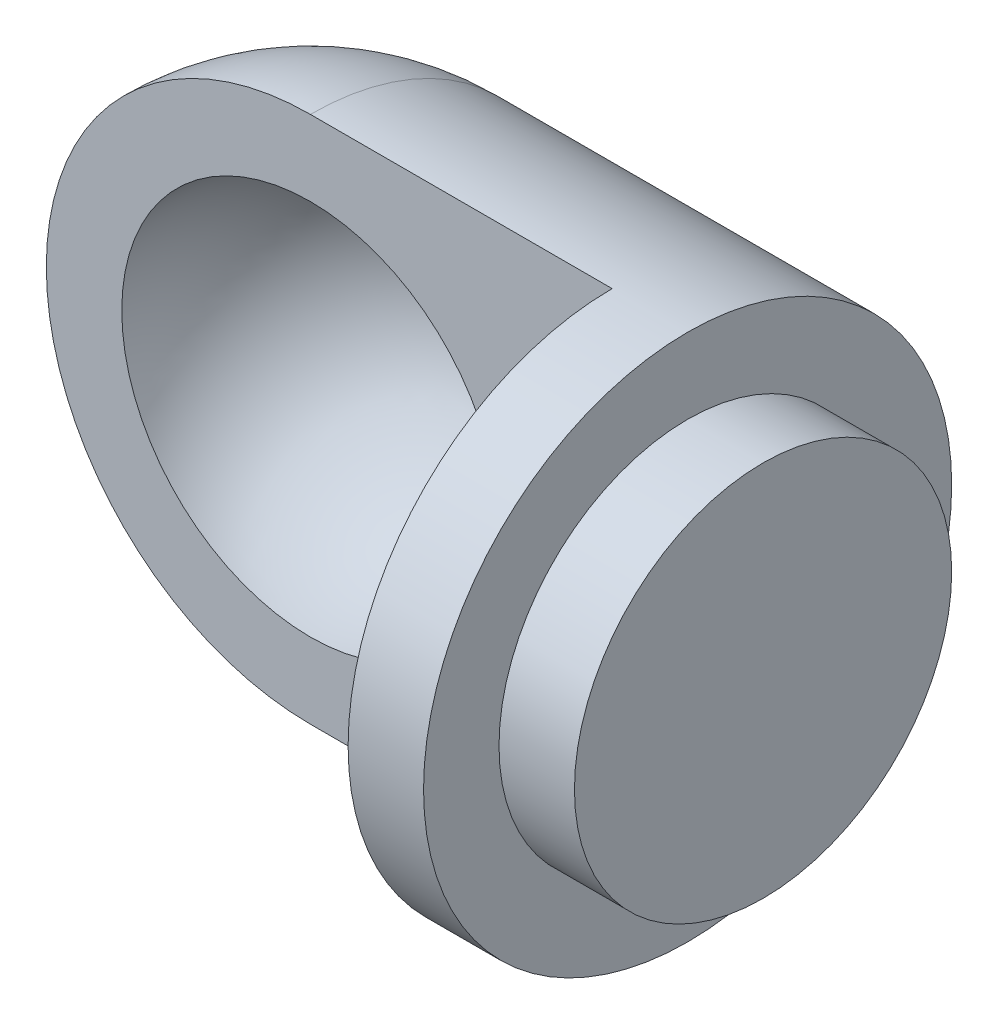
ISO-10303-21;
HEADER;
FILE_DESCRIPTION(('STEP AP214'),'2;1');
FILE_NAME('part.step','',(''),(''),'','','');
FILE_SCHEMA(('AUTOMOTIVE_DESIGN { 1 0 10303 214 1 1 1 1 }'));
ENDSEC;
DATA;
#1=APPLICATION_CONTEXT('core data for automotive mechanical design processes');
#2=APPLICATION_PROTOCOL_DEFINITION('international standard','automotive_design',2000,#1);
#3=PRODUCT_CONTEXT('',#1,'mechanical');
#4=PRODUCT('Part','Part','',(#3));
#5=PRODUCT_RELATED_PRODUCT_CATEGORY('part','',(#4));
#6=PRODUCT_DEFINITION_FORMATION('','',#4);
#7=PRODUCT_DEFINITION_CONTEXT('part definition',#1,'design');
#8=PRODUCT_DEFINITION('design','',#6,#7);
#9=PRODUCT_DEFINITION_SHAPE('','',#8);
#10=(LENGTH_UNIT() NAMED_UNIT(*) SI_UNIT(.MILLI.,.METRE.));
#11=(NAMED_UNIT(*) PLANE_ANGLE_UNIT() SI_UNIT($,.RADIAN.));
#12=(NAMED_UNIT(*) SI_UNIT($,.STERADIAN.) SOLID_ANGLE_UNIT());
#13=UNCERTAINTY_MEASURE_WITH_UNIT(LENGTH_MEASURE(1.E-05),#10,'distance_accuracy_value','');
#14=(GEOMETRIC_REPRESENTATION_CONTEXT(3) GLOBAL_UNCERTAINTY_ASSIGNED_CONTEXT((#13)) GLOBAL_UNIT_ASSIGNED_CONTEXT((#10,
#11,#12)) REPRESENTATION_CONTEXT('',''));
#15=CARTESIAN_POINT('',(0.,0.,0.));
#16=DIRECTION('',(0.,0.,1.));
#17=DIRECTION('',(1.,0.,0.));
#18=AXIS2_PLACEMENT_3D('',#15,#16,#17);
#19=CARTESIAN_POINT('',(-50.,0.,0.));
#20=DIRECTION('',(0.,0.,1.));
#21=DIRECTION('',(0.,-1.,0.));
#22=AXIS2_PLACEMENT_3D('',#19,#20,#21);
#23=PLANE('',#22);
#24=CARTESIAN_POINT('',(-50.,0.,0.));
#25=DIRECTION('',(0.,0.,-1.));
#26=DIRECTION('',(0.,-1.,0.));
#27=AXIS2_PLACEMENT_3D('',#24,#25,#26);
#28=CIRCLE('',#27,25.);
#29=CARTESIAN_POINT('',(-50.,-25.,0.));
#30=VERTEX_POINT('',#29);
#31=EDGE_CURVE('E69',#30,#30,#28,.T.);
#32=ORIENTED_EDGE('',*,*,#31,.T.);
#33=EDGE_LOOP('',(#32));
#34=FACE_BOUND('',#33,.T.);
#35=DIRECTION('',(-1.,0.,0.));
#36=VECTOR('',#35,1.);
#37=CARTESIAN_POINT('',(-50.,-35.,1.19680515214206E-13));
#38=LINE('',#37,#36);
#39=CARTESIAN_POINT('',(-10.,-35.,-1.2270611318857E-13));
#40=VERTEX_POINT('',#39);
#41=CARTESIAN_POINT('',(-50.,-35.,1.19680515214206E-13));
#42=VERTEX_POINT('',#41);
#43=EDGE_CURVE('E53',#40,#42,#38,.T.);
#44=ORIENTED_EDGE('',*,*,#43,.F.);
#45=DIRECTION('',(0.,1.,0.));
#46=VECTOR('',#45,1.);
#47=CARTESIAN_POINT('',(-10.,0.,0.));
#48=LINE('',#47,#46);
#49=CARTESIAN_POINT('',(-10.,35.,1.21697580530449E-13));
#50=VERTEX_POINT('',#49);
#51=EDGE_CURVE('E11',#40,#50,#48,.T.);
#52=ORIENTED_EDGE('',*,*,#51,.T.);
#53=DIRECTION('',(-1.,0.,0.));
#54=VECTOR('',#53,1.);
#55=CARTESIAN_POINT('',(-50.,35.,1.19680515214206E-13));
#56=LINE('',#55,#54);
#57=CARTESIAN_POINT('',(-50.,35.,1.19680515214206E-13));
#58=VERTEX_POINT('',#57);
#59=EDGE_CURVE('E46',#50,#58,#56,.T.);
#60=ORIENTED_EDGE('',*,*,#59,.T.);
#61=CARTESIAN_POINT('',(-50.,0.,0.));
#62=DIRECTION('',(0.,0.,1.));
#63=DIRECTION('',(0.,-1.,0.));
#64=AXIS2_PLACEMENT_3D('',#61,#62,#63);
#65=CIRCLE('',#64,35.);
#66=EDGE_CURVE('E74',#58,#42,#65,.T.);
#67=ORIENTED_EDGE('',*,*,#66,.T.);
#68=EDGE_LOOP('',(#44,#52,#60,#67));
#69=FACE_BOUND('',#68,.T.);
#70=ADVANCED_FACE('F32',(#34,#69),#23,.T.);
#71=CARTESIAN_POINT('',(-50.,0.,0.));
#72=DIRECTION('',(-1.,0.,0.));
#73=DIRECTION('',(0.,1.,0.));
#74=AXIS2_PLACEMENT_3D('',#71,#72,#73);
#75=SPHERICAL_SURFACE('',#74,35.);
#76=CARTESIAN_POINT('',(-50.,0.,0.));
#77=DIRECTION('',(-1.,0.,0.));
#78=DIRECTION('',(0.,0.,1.));
#79=AXIS2_PLACEMENT_3D('',#76,#77,#78);
#80=CIRCLE('',#79,35.);
#81=EDGE_CURVE('E67',#58,#42,#80,.T.);
#82=ORIENTED_EDGE('',*,*,#81,.T.);
#83=ORIENTED_EDGE('',*,*,#66,.F.);
#84=EDGE_LOOP('',(#82,#83));
#85=FACE_BOUND('',#84,.T.);
#86=ADVANCED_FACE('F86',(#85),#75,.T.);
#87=CARTESIAN_POINT('',(-50.,0.,0.));
#88=DIRECTION('',(-1.,0.,0.));
#89=DIRECTION('',(0.,1.,0.));
#90=AXIS2_PLACEMENT_3D('',#87,#88,#89);
#91=SPHERICAL_SURFACE('',#90,25.);
#92=CARTESIAN_POINT('',(-50.,0.,0.));
#93=DIRECTION('',(0.,0.,-1.));
#94=DIRECTION('',(0.,-1.,0.));
#95=AXIS2_PLACEMENT_3D('',#92,#93,#94);
#96=SPHERICAL_SURFACE('',#95,25.);
#97=ORIENTED_EDGE('',*,*,#31,.F.);
#98=EDGE_LOOP('',(#97));
#99=FACE_BOUND('',#98,.T.);
#100=ADVANCED_FACE('F34',(#99),#96,.F.);
#101=CARTESIAN_POINT('',(0.,0.,0.));
#102=DIRECTION('',(-1.,0.,0.));
#103=DIRECTION('',(0.,0.,1.));
#104=AXIS2_PLACEMENT_3D('',#101,#102,#103);
#105=PLANE('',#104);
#106=CARTESIAN_POINT('',(0.,0.,0.));
#107=DIRECTION('',(1.,0.,0.));
#108=DIRECTION('',(0.,0.,-1.));
#109=AXIS2_PLACEMENT_3D('',#106,#107,#108);
#110=CIRCLE('',#109,25.);
#111=CARTESIAN_POINT('',(0.,0.,-25.));
#112=VERTEX_POINT('',#111);
#113=EDGE_CURVE('E40',#112,#112,#110,.T.);
#114=ORIENTED_EDGE('',*,*,#113,.F.);
#115=EDGE_LOOP('',(#114));
#116=FACE_BOUND('',#115,.T.);
#117=CARTESIAN_POINT('',(0.,0.,0.));
#118=DIRECTION('',(-1.,0.,0.));
#119=DIRECTION('',(0.,0.,1.));
#120=AXIS2_PLACEMENT_3D('',#117,#118,#119);
#121=CIRCLE('',#120,35.);
#122=CARTESIAN_POINT('',(0.,0.,35.));
#123=VERTEX_POINT('',#122);
#124=EDGE_CURVE('E71',#123,#123,#121,.T.);
#125=ORIENTED_EDGE('',*,*,#124,.F.);
#126=EDGE_LOOP('',(#125));
#127=FACE_BOUND('',#126,.T.);
#128=ADVANCED_FACE('F93',(#116,#127),#105,.F.);
#129=CARTESIAN_POINT('',(-25.,0.,0.));
#130=DIRECTION('',(-1.,0.,0.));
#131=DIRECTION('',(0.,0.,1.));
#132=AXIS2_PLACEMENT_3D('',#129,#130,#131);
#133=CYLINDRICAL_SURFACE('',#132,35.);
#134=CARTESIAN_POINT('',(-10.,0.,0.));
#135=DIRECTION('',(1.,0.,0.));
#136=DIRECTION('',(0.,0.,-1.));
#137=AXIS2_PLACEMENT_3D('',#134,#135,#136);
#138=CIRCLE('',#137,35.);
#139=EDGE_CURVE('E60',#50,#40,#138,.T.);
#140=ORIENTED_EDGE('',*,*,#139,.T.);
#141=ORIENTED_EDGE('',*,*,#43,.T.);
#142=ORIENTED_EDGE('',*,*,#81,.F.);
#143=ORIENTED_EDGE('',*,*,#59,.F.);
#144=EDGE_LOOP('',(#140,#141,#142,#143));
#145=FACE_BOUND('',#144,.T.);
#146=ORIENTED_EDGE('',*,*,#124,.T.);
#147=EDGE_LOOP('',(#146));
#148=FACE_BOUND('',#147,.T.);
#149=ADVANCED_FACE('F64',(#145,#148),#133,.T.);
#150=CARTESIAN_POINT('',(10.,0.,0.));
#151=DIRECTION('',(-1.,0.,0.));
#152=DIRECTION('',(0.,0.,1.));
#153=AXIS2_PLACEMENT_3D('',#150,#151,#152);
#154=CYLINDRICAL_SURFACE('',#153,25.);
#155=CARTESIAN_POINT('',(10.,0.,0.));
#156=DIRECTION('',(1.,0.,0.));
#157=DIRECTION('',(0.,0.,-1.));
#158=AXIS2_PLACEMENT_3D('',#155,#156,#157);
#159=CIRCLE('',#158,25.);
#160=CARTESIAN_POINT('',(10.,0.,-25.));
#161=VERTEX_POINT('',#160);
#162=EDGE_CURVE('E62',#161,#161,#159,.T.);
#163=ORIENTED_EDGE('',*,*,#162,.F.);
#164=EDGE_LOOP('',(#163));
#165=FACE_BOUND('',#164,.T.);
#166=ORIENTED_EDGE('',*,*,#113,.T.);
#167=EDGE_LOOP('',(#166));
#168=FACE_BOUND('',#167,.T.);
#169=ADVANCED_FACE('F100',(#165,#168),#154,.T.);
#170=CARTESIAN_POINT('',(10.,0.,0.));
#171=DIRECTION('',(1.,0.,0.));
#172=DIRECTION('',(0.,0.,-1.));
#173=AXIS2_PLACEMENT_3D('',#170,#171,#172);
#174=PLANE('',#173);
#175=ORIENTED_EDGE('',*,*,#162,.T.);
#176=EDGE_LOOP('',(#175));
#177=FACE_BOUND('',#176,.T.);
#178=ADVANCED_FACE('F119',(#177),#174,.T.);
#179=CARTESIAN_POINT('',(-10.,0.,0.));
#180=DIRECTION('',(1.,0.,0.));
#181=DIRECTION('',(0.,0.,-1.));
#182=AXIS2_PLACEMENT_3D('',#179,#180,#181);
#183=PLANE('',#182);
#184=ORIENTED_EDGE('',*,*,#51,.F.);
#185=ORIENTED_EDGE('',*,*,#139,.F.);
#186=EDGE_LOOP('',(#184,#185));
#187=FACE_BOUND('',#186,.T.);
#188=ADVANCED_FACE('F61',(#187),#183,.F.);
#189=CLOSED_SHELL('',(#70,#86,#100,#128,#149,#169,#178,#188));
#190=MANIFOLD_SOLID_BREP('B2',#189);
#191=ADVANCED_BREP_SHAPE_REPRESENTATION('',(#18,#190),#14);
#192=SHAPE_DEFINITION_REPRESENTATION(#9,#191);
ENDSEC;
END-ISO-10303-21;
